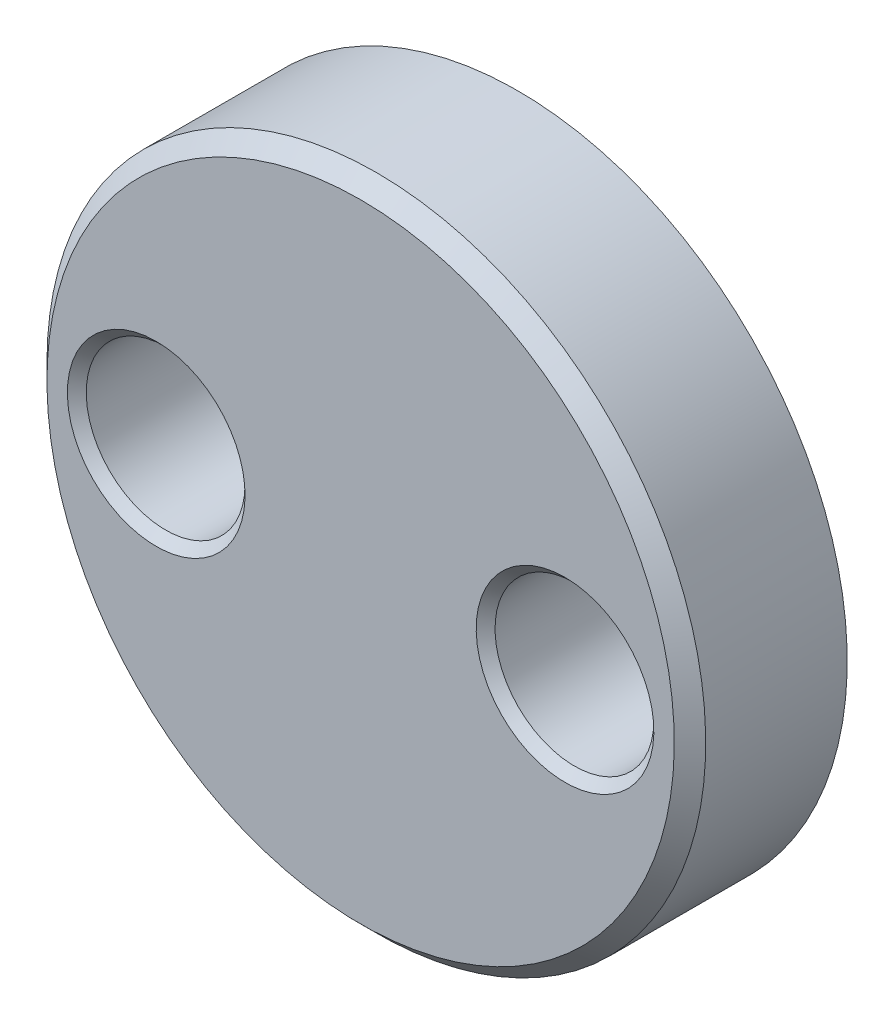
ISO-10303-21;
HEADER;
FILE_DESCRIPTION(('STEP AP214'),'2;1');
FILE_NAME('part.step','',(''),(''),'','','');
FILE_SCHEMA(('AUTOMOTIVE_DESIGN { 1 0 10303 214 1 1 1 1 }'));
ENDSEC;
DATA;
#1=APPLICATION_CONTEXT('core data for automotive mechanical design processes');
#2=APPLICATION_PROTOCOL_DEFINITION('international standard','automotive_design',2000,#1);
#3=PRODUCT_CONTEXT('',#1,'mechanical');
#4=PRODUCT('Part','Part','',(#3));
#5=PRODUCT_RELATED_PRODUCT_CATEGORY('part','',(#4));
#6=PRODUCT_DEFINITION_FORMATION('','',#4);
#7=PRODUCT_DEFINITION_CONTEXT('part definition',#1,'design');
#8=PRODUCT_DEFINITION('design','',#6,#7);
#9=PRODUCT_DEFINITION_SHAPE('','',#8);
#10=(LENGTH_UNIT() NAMED_UNIT(*) SI_UNIT(.MILLI.,.METRE.));
#11=(NAMED_UNIT(*) PLANE_ANGLE_UNIT() SI_UNIT($,.RADIAN.));
#12=(NAMED_UNIT(*) SI_UNIT($,.STERADIAN.) SOLID_ANGLE_UNIT());
#13=UNCERTAINTY_MEASURE_WITH_UNIT(LENGTH_MEASURE(1.E-05),#10,'distance_accuracy_value','');
#14=(GEOMETRIC_REPRESENTATION_CONTEXT(3) GLOBAL_UNCERTAINTY_ASSIGNED_CONTEXT((#13)) GLOBAL_UNIT_ASSIGNED_CONTEXT((#10,
#11,#12)) REPRESENTATION_CONTEXT('',''));
#15=CARTESIAN_POINT('',(0.,0.,0.));
#16=DIRECTION('',(0.,0.,1.));
#17=DIRECTION('',(1.,0.,0.));
#18=AXIS2_PLACEMENT_3D('',#15,#16,#17);
#19=CARTESIAN_POINT('',(-6.5,0.,5.));
#20=DIRECTION('',(0.,0.,-1.));
#21=DIRECTION('',(-1.,0.,0.));
#22=AXIS2_PLACEMENT_3D('',#19,#20,#21);
#23=CYLINDRICAL_SURFACE('',#22,2.525);
#24=CARTESIAN_POINT('',(-6.5,0.,4.7));
#25=DIRECTION('',(0.,0.,-1.));
#26=DIRECTION('',(1.,0.,0.));
#27=AXIS2_PLACEMENT_3D('',#24,#25,#26);
#28=CIRCLE('',#27,2.525);
#29=CARTESIAN_POINT('',(-3.975,0.,4.7));
#30=VERTEX_POINT('',#29);
#31=CARTESIAN_POINT('',(-6.5,2.525,4.7));
#32=VERTEX_POINT('',#31);
#33=EDGE_CURVE('E88',#30,#32,#28,.T.);
#34=ORIENTED_EDGE('',*,*,#33,.F.);
#35=DIRECTION('',(0.,0.,-1.));
#36=VECTOR('',#35,1.);
#37=CARTESIAN_POINT('',(-3.975,0.,5.));
#38=LINE('',#37,#36);
#39=CARTESIAN_POINT('',(-3.975,0.,0.));
#40=VERTEX_POINT('',#39);
#41=EDGE_CURVE('E11',#30,#40,#38,.T.);
#42=ORIENTED_EDGE('',*,*,#41,.T.);
#43=CARTESIAN_POINT('',(-6.5,0.,0.));
#44=DIRECTION('',(0.,0.,-1.));
#45=DIRECTION('',(-1.,0.,0.));
#46=AXIS2_PLACEMENT_3D('',#43,#44,#45);
#47=CIRCLE('',#46,2.525);
#48=EDGE_CURVE('E103',#40,#40,#47,.T.);
#49=ORIENTED_EDGE('',*,*,#48,.T.);
#50=ORIENTED_EDGE('',*,*,#41,.F.);
#51=CARTESIAN_POINT('',(-6.5,0.,4.7));
#52=DIRECTION('',(0.,0.,-1.));
#53=DIRECTION('',(1.,0.,0.));
#54=AXIS2_PLACEMENT_3D('',#51,#52,#53);
#55=CIRCLE('',#54,2.525);
#56=EDGE_CURVE('E21',#32,#30,#55,.T.);
#57=ORIENTED_EDGE('',*,*,#56,.F.);
#58=EDGE_LOOP('',(#34,#42,#49,#50,#57));
#59=FACE_BOUND('',#58,.T.);
#60=ADVANCED_FACE('F17',(#59),#23,.F.);
#61=CARTESIAN_POINT('',(-6.5,0.,4.849999999331));
#62=DIRECTION('',(0.,0.,1.));
#63=DIRECTION('',(0.,-1.,0.));
#64=AXIS2_PLACEMENT_3D('',#61,#62,#63);
#65=CONICAL_SURFACE('',#64,2.674999999331,0.785398163397448);
#66=ORIENTED_EDGE('',*,*,#33,.T.);
#67=DIRECTION('',(0.,0.707106781186548,0.707106781186548));
#68=VECTOR('',#67,1.);
#69=CARTESIAN_POINT('',(-6.5,2.674999999331,4.849999999331));
#70=LINE('',#69,#68);
#71=CARTESIAN_POINT('',(-6.5,2.825,5.));
#72=VERTEX_POINT('',#71);
#73=EDGE_CURVE('E97',#32,#72,#70,.T.);
#74=ORIENTED_EDGE('',*,*,#73,.T.);
#75=CARTESIAN_POINT('',(-6.5,0.,5.));
#76=DIRECTION('',(0.,0.,-1.));
#77=DIRECTION('',(1.,0.,0.));
#78=AXIS2_PLACEMENT_3D('',#75,#76,#77);
#79=CIRCLE('',#78,2.825);
#80=EDGE_CURVE('E118',#72,#72,#79,.T.);
#81=ORIENTED_EDGE('',*,*,#80,.F.);
#82=ORIENTED_EDGE('',*,*,#73,.F.);
#83=ORIENTED_EDGE('',*,*,#56,.T.);
#84=EDGE_LOOP('',(#66,#74,#81,#82,#83));
#85=FACE_BOUND('',#84,.T.);
#86=ADVANCED_FACE('F178',(#85),#65,.F.);
#87=CARTESIAN_POINT('',(6.5,0.,5.));
#88=DIRECTION('',(0.,0.,-1.));
#89=DIRECTION('',(-1.,0.,0.));
#90=AXIS2_PLACEMENT_3D('',#87,#88,#89);
#91=CYLINDRICAL_SURFACE('',#90,2.525);
#92=CARTESIAN_POINT('',(6.5,0.,4.7));
#93=DIRECTION('',(0.,0.,-1.));
#94=DIRECTION('',(1.,0.,0.));
#95=AXIS2_PLACEMENT_3D('',#92,#93,#94);
#96=CIRCLE('',#95,2.525);
#97=CARTESIAN_POINT('',(9.025,0.,4.7));
#98=VERTEX_POINT('',#97);
#99=CARTESIAN_POINT('',(6.5,2.525,4.7));
#100=VERTEX_POINT('',#99);
#101=EDGE_CURVE('E85',#98,#100,#96,.T.);
#102=ORIENTED_EDGE('',*,*,#101,.F.);
#103=DIRECTION('',(0.,0.,-1.));
#104=VECTOR('',#103,1.);
#105=CARTESIAN_POINT('',(9.025,0.,5.));
#106=LINE('',#105,#104);
#107=CARTESIAN_POINT('',(9.025,0.,0.));
#108=VERTEX_POINT('',#107);
#109=EDGE_CURVE('E80',#98,#108,#106,.T.);
#110=ORIENTED_EDGE('',*,*,#109,.T.);
#111=CARTESIAN_POINT('',(6.5,0.,0.));
#112=DIRECTION('',(0.,0.,-1.));
#113=DIRECTION('',(-1.,0.,0.));
#114=AXIS2_PLACEMENT_3D('',#111,#112,#113);
#115=CIRCLE('',#114,2.525);
#116=EDGE_CURVE('E83',#108,#108,#115,.T.);
#117=ORIENTED_EDGE('',*,*,#116,.T.);
#118=ORIENTED_EDGE('',*,*,#109,.F.);
#119=CARTESIAN_POINT('',(6.5,0.,4.7));
#120=DIRECTION('',(0.,0.,-1.));
#121=DIRECTION('',(1.,0.,0.));
#122=AXIS2_PLACEMENT_3D('',#119,#120,#121);
#123=CIRCLE('',#122,2.525);
#124=EDGE_CURVE('E89',#100,#98,#123,.T.);
#125=ORIENTED_EDGE('',*,*,#124,.F.);
#126=EDGE_LOOP('',(#102,#110,#117,#118,#125));
#127=FACE_BOUND('',#126,.T.);
#128=ADVANCED_FACE('F81',(#127),#91,.F.);
#129=CARTESIAN_POINT('',(6.5,0.,4.849999999331));
#130=DIRECTION('',(0.,0.,1.));
#131=DIRECTION('',(0.,-1.,0.));
#132=AXIS2_PLACEMENT_3D('',#129,#130,#131);
#133=CONICAL_SURFACE('',#132,2.674999999331,0.785398163397448);
#134=ORIENTED_EDGE('',*,*,#101,.T.);
#135=DIRECTION('',(0.,0.707106781186548,0.707106781186548));
#136=VECTOR('',#135,1.);
#137=CARTESIAN_POINT('',(6.5,2.674999999331,4.849999999331));
#138=LINE('',#137,#136);
#139=CARTESIAN_POINT('',(6.5,2.825,5.));
#140=VERTEX_POINT('',#139);
#141=EDGE_CURVE('E99',#100,#140,#138,.T.);
#142=ORIENTED_EDGE('',*,*,#141,.T.);
#143=CARTESIAN_POINT('',(6.5,0.,5.));
#144=DIRECTION('',(0.,0.,-1.));
#145=DIRECTION('',(1.,0.,0.));
#146=AXIS2_PLACEMENT_3D('',#143,#144,#145);
#147=CIRCLE('',#146,2.825);
#148=EDGE_CURVE('E115',#140,#140,#147,.T.);
#149=ORIENTED_EDGE('',*,*,#148,.F.);
#150=ORIENTED_EDGE('',*,*,#141,.F.);
#151=ORIENTED_EDGE('',*,*,#124,.T.);
#152=EDGE_LOOP('',(#134,#142,#149,#150,#151));
#153=FACE_BOUND('',#152,.T.);
#154=ADVANCED_FACE('F185',(#153),#133,.F.);
#155=CARTESIAN_POINT('',(0.,0.,5.));
#156=DIRECTION('',(0.,0.,1.));
#157=DIRECTION('',(1.,0.,0.));
#158=AXIS2_PLACEMENT_3D('',#155,#156,#157);
#159=PLANE('',#158);
#160=ORIENTED_EDGE('',*,*,#80,.T.);
#161=EDGE_LOOP('',(#160));
#162=FACE_BOUND('',#161,.T.);
#163=ORIENTED_EDGE('',*,*,#148,.T.);
#164=EDGE_LOOP('',(#163));
#165=FACE_BOUND('',#164,.T.);
#166=CARTESIAN_POINT('',(0.,0.,4.999999542106));
#167=DIRECTION('',(0.,0.,1.));
#168=DIRECTION('',(1.,0.,0.));
#169=AXIS2_PLACEMENT_3D('',#166,#167,#168);
#170=CIRCLE('',#169,9.97499875383);
#171=CARTESIAN_POINT('',(0.,9.97499875382827,4.99999954210424));
#172=VERTEX_POINT('',#171);
#173=EDGE_CURVE('E119',#172,#172,#170,.T.);
#174=ORIENTED_EDGE('',*,*,#173,.T.);
#175=EDGE_LOOP('',(#174));
#176=FACE_BOUND('',#175,.T.);
#177=ADVANCED_FACE('F189',(#162,#165,#176),#159,.T.);
#178=CARTESIAN_POINT('',(0.,0.,4.749998952454));
#179=DIRECTION('',(0.,0.,-1.));
#180=DIRECTION('',(0.,-1.,0.));
#181=AXIS2_PLACEMENT_3D('',#178,#179,#180);
#182=CONICAL_SURFACE('',#181,10.22499930077,0.785398077980686);
#183=CARTESIAN_POINT('',(0.,0.,4.499999164622));
#184=DIRECTION('',(0.,0.,1.));
#185=DIRECTION('',(1.,0.,0.));
#186=AXIS2_PLACEMENT_3D('',#183,#184,#185);
#187=CIRCLE('',#186,10.475);
#188=CARTESIAN_POINT('',(-10.475,0.,4.499999164622));
#189=VERTEX_POINT('',#188);
#190=CARTESIAN_POINT('',(0.,10.4749995229468,4.49999868756881));
#191=VERTEX_POINT('',#190);
#192=EDGE_CURVE('E144',#189,#191,#187,.T.);
#193=ORIENTED_EDGE('',*,*,#192,.T.);
#194=DIRECTION('',(0.,-0.707106720787773,0.707106841585317));
#195=VECTOR('',#194,1.);
#196=CARTESIAN_POINT('',(0.,10.22499930077,4.749998952454));
#197=LINE('',#196,#195);
#198=EDGE_CURVE('E113',#191,#172,#197,.T.);
#199=ORIENTED_EDGE('',*,*,#198,.T.);
#200=ORIENTED_EDGE('',*,*,#173,.F.);
#201=ORIENTED_EDGE('',*,*,#198,.F.);
#202=CARTESIAN_POINT('',(0.,0.,4.499999164622));
#203=DIRECTION('',(0.,0.,1.));
#204=DIRECTION('',(1.,0.,0.));
#205=AXIS2_PLACEMENT_3D('',#202,#203,#204);
#206=CIRCLE('',#205,10.475);
#207=EDGE_CURVE('E111',#191,#189,#206,.T.);
#208=ORIENTED_EDGE('',*,*,#207,.T.);
#209=EDGE_LOOP('',(#193,#199,#200,#201,#208));
#210=FACE_BOUND('',#209,.T.);
#211=ADVANCED_FACE('F19',(#210),#182,.T.);
#212=CARTESIAN_POINT('',(0.,0.,0.));
#213=DIRECTION('',(0.,0.,1.));
#214=DIRECTION('',(1.,0.,0.));
#215=AXIS2_PLACEMENT_3D('',#212,#213,#214);
#216=CYLINDRICAL_SURFACE('',#215,10.475);
#217=ORIENTED_EDGE('',*,*,#192,.F.);
#218=DIRECTION('',(0.,0.,-1.));
#219=VECTOR('',#218,1.);
#220=CARTESIAN_POINT('',(-10.475,0.,0.));
#221=LINE('',#220,#219);
#222=CARTESIAN_POINT('',(-10.475,0.,0.));
#223=VERTEX_POINT('',#222);
#224=EDGE_CURVE('E114',#189,#223,#221,.T.);
#225=ORIENTED_EDGE('',*,*,#224,.T.);
#226=CARTESIAN_POINT('',(0.,0.,0.));
#227=DIRECTION('',(0.,0.,1.));
#228=DIRECTION('',(1.,0.,0.));
#229=AXIS2_PLACEMENT_3D('',#226,#227,#228);
#230=CIRCLE('',#229,10.475);
#231=EDGE_CURVE('E107',#223,#223,#230,.T.);
#232=ORIENTED_EDGE('',*,*,#231,.T.);
#233=ORIENTED_EDGE('',*,*,#224,.F.);
#234=ORIENTED_EDGE('',*,*,#207,.F.);
#235=EDGE_LOOP('',(#217,#225,#232,#233,#234));
#236=FACE_BOUND('',#235,.T.);
#237=ADVANCED_FACE('F162',(#236),#216,.T.);
#238=CARTESIAN_POINT('',(0.,0.,0.));
#239=DIRECTION('',(0.,0.,1.));
#240=DIRECTION('',(1.,0.,0.));
#241=AXIS2_PLACEMENT_3D('',#238,#239,#240);
#242=PLANE('',#241);
#243=ORIENTED_EDGE('',*,*,#116,.F.);
#244=EDGE_LOOP('',(#243));
#245=FACE_BOUND('',#244,.T.);
#246=ORIENTED_EDGE('',*,*,#48,.F.);
#247=EDGE_LOOP('',(#246));
#248=FACE_BOUND('',#247,.T.);
#249=ORIENTED_EDGE('',*,*,#231,.F.);
#250=EDGE_LOOP('',(#249));
#251=FACE_BOUND('',#250,.T.);
#252=ADVANCED_FACE('F165',(#245,#248,#251),#242,.F.);
#253=CLOSED_SHELL('',(#60,#86,#128,#154,#177,#211,#237,#252));
#254=MANIFOLD_SOLID_BREP('B1',#253);
#255=ADVANCED_BREP_SHAPE_REPRESENTATION('',(#18,#254),#14);
#256=SHAPE_DEFINITION_REPRESENTATION(#9,#255);
ENDSEC;
END-ISO-10303-21;
